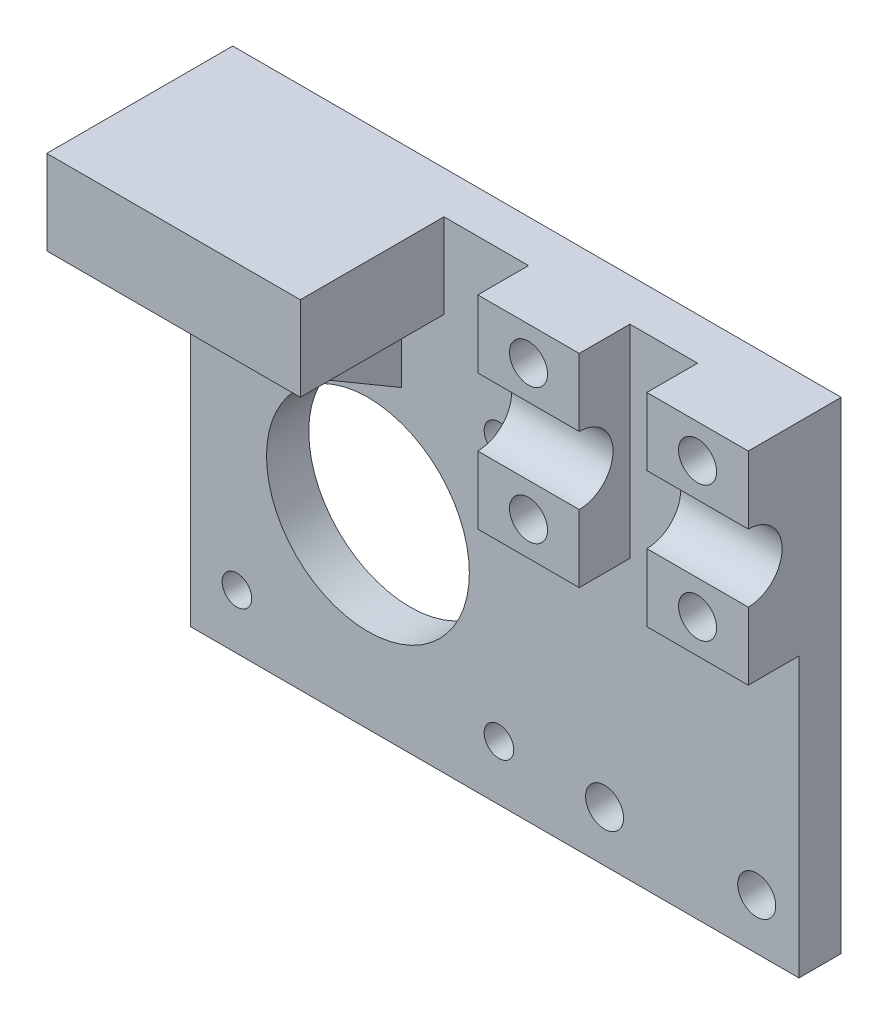
ISO-10303-21;
HEADER;
FILE_DESCRIPTION(('STEP AP214'),'2;1');
FILE_NAME('part.step','',(''),(''),'','','');
FILE_SCHEMA(('AUTOMOTIVE_DESIGN { 1 0 10303 214 1 1 1 1 }'));
ENDSEC;
DATA;
#1=APPLICATION_CONTEXT('core data for automotive mechanical design processes');
#2=APPLICATION_PROTOCOL_DEFINITION('international standard','automotive_design',2000,#1);
#3=PRODUCT_CONTEXT('',#1,'mechanical');
#4=PRODUCT('Part','Part','',(#3));
#5=PRODUCT_RELATED_PRODUCT_CATEGORY('part','',(#4));
#6=PRODUCT_DEFINITION_FORMATION('','',#4);
#7=PRODUCT_DEFINITION_CONTEXT('part definition',#1,'design');
#8=PRODUCT_DEFINITION('design','',#6,#7);
#9=PRODUCT_DEFINITION_SHAPE('','',#8);
#10=(LENGTH_UNIT() NAMED_UNIT(*) SI_UNIT(.MILLI.,.METRE.));
#11=(NAMED_UNIT(*) PLANE_ANGLE_UNIT() SI_UNIT($,.RADIAN.));
#12=(NAMED_UNIT(*) SI_UNIT($,.STERADIAN.) SOLID_ANGLE_UNIT());
#13=UNCERTAINTY_MEASURE_WITH_UNIT(LENGTH_MEASURE(1.E-05),#10,'distance_accuracy_value','');
#14=(GEOMETRIC_REPRESENTATION_CONTEXT(3) GLOBAL_UNCERTAINTY_ASSIGNED_CONTEXT((#13)) GLOBAL_UNIT_ASSIGNED_CONTEXT((#10,
#11,#12)) REPRESENTATION_CONTEXT('',''));
#15=CARTESIAN_POINT('',(0.,0.,0.));
#16=DIRECTION('',(0.,0.,1.));
#17=DIRECTION('',(1.,0.,0.));
#18=AXIS2_PLACEMENT_3D('',#15,#16,#17);
#19=CARTESIAN_POINT('',(-56.,18.5,22.));
#20=DIRECTION('',(0.,1.,0.));
#21=DIRECTION('',(0.,0.,1.));
#22=AXIS2_PLACEMENT_3D('',#19,#20,#21);
#23=PLANE('',#22);
#24=DIRECTION('',(0.,0.,1.));
#25=VECTOR('',#24,1.);
#26=CARTESIAN_POINT('',(-31.,18.5,5.));
#27=LINE('',#26,#25);
#28=CARTESIAN_POINT('',(-31.,18.5,5.));
#29=VERTEX_POINT('',#28);
#30=CARTESIAN_POINT('',(-31.,18.5,22.));
#31=VERTEX_POINT('',#30);
#32=EDGE_CURVE('E232',#29,#31,#27,.T.);
#33=ORIENTED_EDGE('',*,*,#32,.F.);
#34=DIRECTION('',(1.,0.,0.));
#35=VECTOR('',#34,1.);
#36=CARTESIAN_POINT('',(-56.,18.5,5.));
#37=LINE('',#36,#35);
#38=CARTESIAN_POINT('',(-26.,18.5,5.));
#39=VERTEX_POINT('',#38);
#40=EDGE_CURVE('E248',#29,#39,#37,.T.);
#41=ORIENTED_EDGE('',*,*,#40,.T.);
#42=DIRECTION('',(0.,0.,-1.));
#43=VECTOR('',#42,1.);
#44=CARTESIAN_POINT('',(-26.,18.5,22.));
#45=LINE('',#44,#43);
#46=CARTESIAN_POINT('',(-26.,18.5,22.));
#47=VERTEX_POINT('',#46);
#48=EDGE_CURVE('E270',#47,#39,#45,.T.);
#49=ORIENTED_EDGE('',*,*,#48,.F.);
#50=DIRECTION('',(1.,0.,0.));
#51=VECTOR('',#50,1.);
#52=CARTESIAN_POINT('',(-56.,18.5,22.));
#53=LINE('',#52,#51);
#54=EDGE_CURVE('E254',#31,#47,#53,.T.);
#55=ORIENTED_EDGE('',*,*,#54,.F.);
#56=EDGE_LOOP('',(#33,#41,#49,#55));
#57=FACE_BOUND('',#56,.T.);
#58=ADVANCED_FACE('F34',(#57),#23,.F.);
#59=CARTESIAN_POINT('',(0.,0.,5.));
#60=DIRECTION('',(0.,0.,1.));
#61=DIRECTION('',(1.,0.,0.));
#62=AXIS2_PLACEMENT_3D('',#59,#60,#61);
#63=PLANE('',#62);
#64=DIRECTION('',(1.,0.,0.));
#65=VECTOR('',#64,1.);
#66=CARTESIAN_POINT('',(-36.,15.5,5.));
#67=LINE('',#66,#65);
#68=CARTESIAN_POINT('',(-46.,15.5,5.));
#69=VERTEX_POINT('',#68);
#70=CARTESIAN_POINT('',(-36.,15.5,5.));
#71=VERTEX_POINT('',#70);
#72=EDGE_CURVE('E60',#69,#71,#67,.T.);
#73=ORIENTED_EDGE('',*,*,#72,.F.);
#74=DIRECTION('',(0.,-1.,0.));
#75=VECTOR('',#74,1.);
#76=CARTESIAN_POINT('',(-46.,18.5,5.));
#77=LINE('',#76,#75);
#78=CARTESIAN_POINT('',(-46.,18.5,5.));
#79=VERTEX_POINT('',#78);
#80=EDGE_CURVE('E223',#79,#69,#77,.T.);
#81=ORIENTED_EDGE('',*,*,#80,.F.);
#82=CARTESIAN_POINT('',(-56.,18.5,5.));
#83=VERTEX_POINT('',#82);
#84=EDGE_CURVE('E264',#83,#79,#37,.T.);
#85=ORIENTED_EDGE('',*,*,#84,.F.);
#86=DIRECTION('',(0.,-1.,0.));
#87=VECTOR('',#86,1.);
#88=CARTESIAN_POINT('',(-56.,28.5,5.));
#89=LINE('',#88,#87);
#90=CARTESIAN_POINT('',(-56.,-28.5,5.));
#91=VERTEX_POINT('',#90);
#92=EDGE_CURVE('E431',#83,#91,#89,.T.);
#93=ORIENTED_EDGE('',*,*,#92,.T.);
#94=DIRECTION('',(1.,0.,0.));
#95=VECTOR('',#94,1.);
#96=CARTESIAN_POINT('',(-56.,-28.5,5.));
#97=LINE('',#96,#95);
#98=CARTESIAN_POINT('',(16.,-28.5,5.));
#99=VERTEX_POINT('',#98);
#100=EDGE_CURVE('E433',#91,#99,#97,.T.);
#101=ORIENTED_EDGE('',*,*,#100,.T.);
#102=DIRECTION('',(0.,1.,0.));
#103=VECTOR('',#102,1.);
#104=CARTESIAN_POINT('',(16.,28.5,5.));
#105=LINE('',#104,#103);
#106=CARTESIAN_POINT('',(16.,4.49999999999999,5.));
#107=VERTEX_POINT('',#106);
#108=EDGE_CURVE('E436',#99,#107,#105,.T.);
#109=ORIENTED_EDGE('',*,*,#108,.T.);
#110=DIRECTION('',(1.,0.,0.));
#111=VECTOR('',#110,1.);
#112=CARTESIAN_POINT('',(3.99999999999999,4.49999999999999,5.));
#113=LINE('',#112,#111);
#114=CARTESIAN_POINT('',(3.99999999999999,4.49999999999999,5.));
#115=VERTEX_POINT('',#114);
#116=EDGE_CURVE('E401',#115,#107,#113,.T.);
#117=ORIENTED_EDGE('',*,*,#116,.F.);
#118=DIRECTION('',(0.,1.,0.));
#119=VECTOR('',#118,1.);
#120=CARTESIAN_POINT('',(3.99999999999999,4.49999999999999,5.));
#121=LINE('',#120,#119);
#122=CARTESIAN_POINT('',(3.99999999999999,28.5,5.));
#123=VERTEX_POINT('',#122);
#124=EDGE_CURVE('E389',#115,#123,#121,.T.);
#125=ORIENTED_EDGE('',*,*,#124,.T.);
#126=DIRECTION('',(-1.,0.,0.));
#127=VECTOR('',#126,1.);
#128=CARTESIAN_POINT('',(-56.,28.5,5.));
#129=LINE('',#128,#127);
#130=CARTESIAN_POINT('',(-3.99999999999999,28.5,5.));
#131=VERTEX_POINT('',#130);
#132=EDGE_CURVE('E395',#123,#131,#129,.T.);
#133=ORIENTED_EDGE('',*,*,#132,.T.);
#134=DIRECTION('',(0.,1.,0.));
#135=VECTOR('',#134,1.);
#136=CARTESIAN_POINT('',(-3.99999999999999,4.49999999999999,5.));
#137=LINE('',#136,#135);
#138=CARTESIAN_POINT('',(-3.99999999999999,4.49999999999999,5.));
#139=VERTEX_POINT('',#138);
#140=EDGE_CURVE('E331',#139,#131,#137,.T.);
#141=ORIENTED_EDGE('',*,*,#140,.F.);
#142=DIRECTION('',(-1.,0.,0.));
#143=VECTOR('',#142,1.);
#144=CARTESIAN_POINT('',(-3.99999999999999,4.49999999999999,5.));
#145=LINE('',#144,#143);
#146=CARTESIAN_POINT('',(-16.,4.49999999999999,5.));
#147=VERTEX_POINT('',#146);
#148=EDGE_CURVE('E345',#139,#147,#145,.T.);
#149=ORIENTED_EDGE('',*,*,#148,.T.);
#150=DIRECTION('',(0.,1.,0.));
#151=VECTOR('',#150,1.);
#152=CARTESIAN_POINT('',(-16.,4.49999999999999,5.));
#153=LINE('',#152,#151);
#154=CARTESIAN_POINT('',(-16.,28.5,5.));
#155=VERTEX_POINT('',#154);
#156=EDGE_CURVE('E328',#147,#155,#153,.T.);
#157=ORIENTED_EDGE('',*,*,#156,.T.);
#158=CARTESIAN_POINT('',(-26.,28.5,5.));
#159=VERTEX_POINT('',#158);
#160=EDGE_CURVE('E38',#155,#159,#129,.T.);
#161=ORIENTED_EDGE('',*,*,#160,.T.);
#162=DIRECTION('',(0.,1.,0.));
#163=VECTOR('',#162,1.);
#164=CARTESIAN_POINT('',(-26.,28.5,5.));
#165=LINE('',#164,#163);
#166=EDGE_CURVE('E255',#39,#159,#165,.T.);
#167=ORIENTED_EDGE('',*,*,#166,.F.);
#168=ORIENTED_EDGE('',*,*,#40,.F.);
#169=DIRECTION('',(0.,1.,0.));
#170=VECTOR('',#169,1.);
#171=CARTESIAN_POINT('',(-31.,8.49999999999999,5.));
#172=LINE('',#171,#170);
#173=CARTESIAN_POINT('',(-31.,8.49999999999999,5.));
#174=VERTEX_POINT('',#173);
#175=EDGE_CURVE('E209',#174,#29,#172,.T.);
#176=ORIENTED_EDGE('',*,*,#175,.F.);
#177=DIRECTION('',(1.,0.,0.));
#178=VECTOR('',#177,1.);
#179=CARTESIAN_POINT('',(-36.,8.49999999999999,5.));
#180=LINE('',#179,#178);
#181=CARTESIAN_POINT('',(-36.,8.49999999999999,5.));
#182=VERTEX_POINT('',#181);
#183=EDGE_CURVE('E246',#182,#174,#180,.T.);
#184=ORIENTED_EDGE('',*,*,#183,.F.);
#185=DIRECTION('',(0.,1.,0.));
#186=VECTOR('',#185,1.);
#187=CARTESIAN_POINT('',(-36.,8.49999999999999,5.));
#188=LINE('',#187,#186);
#189=EDGE_CURVE('E237',#182,#71,#188,.T.);
#190=ORIENTED_EDGE('',*,*,#189,.T.);
#191=EDGE_LOOP('',(#73,#81,#85,#93,#101,#109,#117,#125,#133,#141,#149,#157,#161,#167,#168,#176,
#184,#190));
#192=FACE_BOUND('',#191,.T.);
#193=CARTESIAN_POINT('',(-35.,-6.50000000000001,5.));
#194=DIRECTION('',(0.,0.,1.));
#195=DIRECTION('',(1.,0.,0.));
#196=AXIS2_PLACEMENT_3D('',#193,#194,#195);
#197=CIRCLE('',#196,12.);
#198=CARTESIAN_POINT('',(-23.,-6.50000000000001,5.));
#199=VERTEX_POINT('',#198);
#200=EDGE_CURVE('E310',#199,#199,#197,.T.);
#201=ORIENTED_EDGE('',*,*,#200,.F.);
#202=EDGE_LOOP('',(#201));
#203=FACE_BOUND('',#202,.T.);
#204=CARTESIAN_POINT('',(-50.5,8.99999999999999,5.));
#205=DIRECTION('',(0.,0.,1.));
#206=DIRECTION('',(1.,0.,0.));
#207=AXIS2_PLACEMENT_3D('',#204,#205,#206);
#208=CIRCLE('',#207,1.75);
#209=CARTESIAN_POINT('',(-48.75,8.99999999999999,5.));
#210=VERTEX_POINT('',#209);
#211=EDGE_CURVE('E304',#210,#210,#208,.T.);
#212=ORIENTED_EDGE('',*,*,#211,.F.);
#213=EDGE_LOOP('',(#212));
#214=FACE_BOUND('',#213,.T.);
#215=CARTESIAN_POINT('',(-19.5,8.99999999999999,5.));
#216=DIRECTION('',(0.,0.,1.));
#217=DIRECTION('',(1.,0.,0.));
#218=AXIS2_PLACEMENT_3D('',#215,#216,#217);
#219=CIRCLE('',#218,1.75);
#220=CARTESIAN_POINT('',(-17.75,8.99999999999999,5.));
#221=VERTEX_POINT('',#220);
#222=EDGE_CURVE('E298',#221,#221,#219,.T.);
#223=ORIENTED_EDGE('',*,*,#222,.F.);
#224=EDGE_LOOP('',(#223));
#225=FACE_BOUND('',#224,.T.);
#226=CARTESIAN_POINT('',(-19.5,-22.,5.));
#227=DIRECTION('',(0.,0.,1.));
#228=DIRECTION('',(1.,0.,0.));
#229=AXIS2_PLACEMENT_3D('',#226,#227,#228);
#230=CIRCLE('',#229,1.75);
#231=CARTESIAN_POINT('',(-17.75,-22.,5.));
#232=VERTEX_POINT('',#231);
#233=EDGE_CURVE('E292',#232,#232,#230,.T.);
#234=ORIENTED_EDGE('',*,*,#233,.F.);
#235=EDGE_LOOP('',(#234));
#236=FACE_BOUND('',#235,.T.);
#237=CARTESIAN_POINT('',(-50.5,-22.,5.));
#238=DIRECTION('',(0.,0.,1.));
#239=DIRECTION('',(1.,0.,0.));
#240=AXIS2_PLACEMENT_3D('',#237,#238,#239);
#241=CIRCLE('',#240,1.75);
#242=CARTESIAN_POINT('',(-48.75,-22.,5.));
#243=VERTEX_POINT('',#242);
#244=EDGE_CURVE('E286',#243,#243,#241,.T.);
#245=ORIENTED_EDGE('',*,*,#244,.F.);
#246=EDGE_LOOP('',(#245));
#247=FACE_BOUND('',#246,.T.);
#248=CARTESIAN_POINT('',(-7.,-22.5,5.));
#249=DIRECTION('',(0.,0.,1.));
#250=DIRECTION('',(1.,0.,0.));
#251=AXIS2_PLACEMENT_3D('',#248,#249,#250);
#252=CIRCLE('',#251,2.25);
#253=CARTESIAN_POINT('',(-4.75,-22.5,5.));
#254=VERTEX_POINT('',#253);
#255=EDGE_CURVE('E280',#254,#254,#252,.T.);
#256=ORIENTED_EDGE('',*,*,#255,.F.);
#257=EDGE_LOOP('',(#256));
#258=FACE_BOUND('',#257,.T.);
#259=CARTESIAN_POINT('',(11.,-22.5,5.));
#260=DIRECTION('',(0.,0.,1.));
#261=DIRECTION('',(1.,0.,0.));
#262=AXIS2_PLACEMENT_3D('',#259,#260,#261);
#263=CIRCLE('',#262,2.25000000000001);
#264=CARTESIAN_POINT('',(13.25,-22.5,5.));
#265=VERTEX_POINT('',#264);
#266=EDGE_CURVE('E276',#265,#265,#263,.T.);
#267=ORIENTED_EDGE('',*,*,#266,.F.);
#268=EDGE_LOOP('',(#267));
#269=FACE_BOUND('',#268,.T.);
#270=ADVANCED_FACE('F468',(#192,#203,#214,#225,#236,#247,#258,#269),#63,.T.);
#271=CARTESIAN_POINT('',(0.,0.,0.));
#272=DIRECTION('',(0.,0.,1.));
#273=DIRECTION('',(1.,0.,0.));
#274=AXIS2_PLACEMENT_3D('',#271,#272,#273);
#275=PLANE('',#274);
#276=DIRECTION('',(1.,0.,0.));
#277=VECTOR('',#276,1.);
#278=CARTESIAN_POINT('',(-36.,15.5,0.));
#279=LINE('',#278,#277);
#280=CARTESIAN_POINT('',(-46.,15.5,0.));
#281=VERTEX_POINT('',#280);
#282=CARTESIAN_POINT('',(-36.,15.5,0.));
#283=VERTEX_POINT('',#282);
#284=EDGE_CURVE('E221',#281,#283,#279,.T.);
#285=ORIENTED_EDGE('',*,*,#284,.T.);
#286=DIRECTION('',(0.,1.,0.));
#287=VECTOR('',#286,1.);
#288=CARTESIAN_POINT('',(-36.,18.5,0.));
#289=LINE('',#288,#287);
#290=CARTESIAN_POINT('',(-36.,18.5,0.));
#291=VERTEX_POINT('',#290);
#292=EDGE_CURVE('E203',#283,#291,#289,.T.);
#293=ORIENTED_EDGE('',*,*,#292,.T.);
#294=DIRECTION('',(-1.,0.,0.));
#295=VECTOR('',#294,1.);
#296=CARTESIAN_POINT('',(-36.,18.5,0.));
#297=LINE('',#296,#295);
#298=CARTESIAN_POINT('',(-46.,18.5,0.));
#299=VERTEX_POINT('',#298);
#300=EDGE_CURVE('E212',#291,#299,#297,.T.);
#301=ORIENTED_EDGE('',*,*,#300,.T.);
#302=DIRECTION('',(0.,-1.,0.));
#303=VECTOR('',#302,1.);
#304=CARTESIAN_POINT('',(-46.,18.5,0.));
#305=LINE('',#304,#303);
#306=EDGE_CURVE('E52',#299,#281,#305,.T.);
#307=ORIENTED_EDGE('',*,*,#306,.T.);
#308=EDGE_LOOP('',(#285,#293,#301,#307));
#309=FACE_BOUND('',#308,.T.);
#310=CARTESIAN_POINT('',(11.,-22.5,0.));
#311=DIRECTION('',(0.,0.,1.));
#312=DIRECTION('',(1.,0.,0.));
#313=AXIS2_PLACEMENT_3D('',#310,#311,#312);
#314=CIRCLE('',#313,2.25000000000001);
#315=CARTESIAN_POINT('',(13.25,-22.5,0.));
#316=VERTEX_POINT('',#315);
#317=EDGE_CURVE('E277',#316,#316,#314,.T.);
#318=ORIENTED_EDGE('',*,*,#317,.T.);
#319=EDGE_LOOP('',(#318));
#320=FACE_BOUND('',#319,.T.);
#321=CARTESIAN_POINT('',(-7.,-22.5,0.));
#322=DIRECTION('',(0.,0.,1.));
#323=DIRECTION('',(1.,0.,0.));
#324=AXIS2_PLACEMENT_3D('',#321,#322,#323);
#325=CIRCLE('',#324,2.25);
#326=CARTESIAN_POINT('',(-4.75,-22.5,0.));
#327=VERTEX_POINT('',#326);
#328=EDGE_CURVE('E283',#327,#327,#325,.T.);
#329=ORIENTED_EDGE('',*,*,#328,.T.);
#330=EDGE_LOOP('',(#329));
#331=FACE_BOUND('',#330,.T.);
#332=CARTESIAN_POINT('',(-50.5,-22.,0.));
#333=DIRECTION('',(0.,0.,1.));
#334=DIRECTION('',(1.,0.,0.));
#335=AXIS2_PLACEMENT_3D('',#332,#333,#334);
#336=CIRCLE('',#335,1.75);
#337=CARTESIAN_POINT('',(-48.75,-22.,0.));
#338=VERTEX_POINT('',#337);
#339=EDGE_CURVE('E289',#338,#338,#336,.T.);
#340=ORIENTED_EDGE('',*,*,#339,.T.);
#341=EDGE_LOOP('',(#340));
#342=FACE_BOUND('',#341,.T.);
#343=CARTESIAN_POINT('',(-19.5,-22.,0.));
#344=DIRECTION('',(0.,0.,1.));
#345=DIRECTION('',(1.,0.,0.));
#346=AXIS2_PLACEMENT_3D('',#343,#344,#345);
#347=CIRCLE('',#346,1.75);
#348=CARTESIAN_POINT('',(-17.75,-22.,0.));
#349=VERTEX_POINT('',#348);
#350=EDGE_CURVE('E295',#349,#349,#347,.T.);
#351=ORIENTED_EDGE('',*,*,#350,.T.);
#352=EDGE_LOOP('',(#351));
#353=FACE_BOUND('',#352,.T.);
#354=CARTESIAN_POINT('',(-19.5,8.99999999999999,0.));
#355=DIRECTION('',(0.,0.,1.));
#356=DIRECTION('',(1.,0.,0.));
#357=AXIS2_PLACEMENT_3D('',#354,#355,#356);
#358=CIRCLE('',#357,1.75);
#359=CARTESIAN_POINT('',(-17.75,8.99999999999999,0.));
#360=VERTEX_POINT('',#359);
#361=EDGE_CURVE('E301',#360,#360,#358,.T.);
#362=ORIENTED_EDGE('',*,*,#361,.T.);
#363=EDGE_LOOP('',(#362));
#364=FACE_BOUND('',#363,.T.);
#365=CARTESIAN_POINT('',(-50.5,8.99999999999999,0.));
#366=DIRECTION('',(0.,0.,1.));
#367=DIRECTION('',(1.,0.,0.));
#368=AXIS2_PLACEMENT_3D('',#365,#366,#367);
#369=CIRCLE('',#368,1.75);
#370=CARTESIAN_POINT('',(-48.75,8.99999999999999,0.));
#371=VERTEX_POINT('',#370);
#372=EDGE_CURVE('E307',#371,#371,#369,.T.);
#373=ORIENTED_EDGE('',*,*,#372,.T.);
#374=EDGE_LOOP('',(#373));
#375=FACE_BOUND('',#374,.T.);
#376=CARTESIAN_POINT('',(-35.,-6.50000000000001,0.));
#377=DIRECTION('',(0.,0.,1.));
#378=DIRECTION('',(1.,0.,0.));
#379=AXIS2_PLACEMENT_3D('',#376,#377,#378);
#380=CIRCLE('',#379,12.);
#381=CARTESIAN_POINT('',(-23.,-6.50000000000001,0.));
#382=VERTEX_POINT('',#381);
#383=EDGE_CURVE('E313',#382,#382,#380,.T.);
#384=ORIENTED_EDGE('',*,*,#383,.T.);
#385=EDGE_LOOP('',(#384));
#386=FACE_BOUND('',#385,.T.);
#387=CARTESIAN_POINT('',(-9.99999999999999,24.5,0.));
#388=DIRECTION('',(0.,0.,-1.));
#389=DIRECTION('',(-1.,0.,0.));
#390=AXIS2_PLACEMENT_3D('',#387,#388,#389);
#391=CIRCLE('',#390,2.25);
#392=CARTESIAN_POINT('',(-12.25,24.5,0.));
#393=VERTEX_POINT('',#392);
#394=EDGE_CURVE('E325',#393,#393,#391,.T.);
#395=ORIENTED_EDGE('',*,*,#394,.F.);
#396=EDGE_LOOP('',(#395));
#397=FACE_BOUND('',#396,.T.);
#398=CARTESIAN_POINT('',(9.99999999999999,8.5,0.));
#399=DIRECTION('',(0.,0.,1.));
#400=DIRECTION('',(1.,0.,0.));
#401=AXIS2_PLACEMENT_3D('',#398,#399,#400);
#402=CIRCLE('',#401,2.25);
#403=CARTESIAN_POINT('',(12.25,8.5,0.));
#404=VERTEX_POINT('',#403);
#405=EDGE_CURVE('E372',#404,#404,#402,.T.);
#406=ORIENTED_EDGE('',*,*,#405,.T.);
#407=EDGE_LOOP('',(#406));
#408=FACE_BOUND('',#407,.T.);
#409=CARTESIAN_POINT('',(9.99999999999999,24.5,0.));
#410=DIRECTION('',(0.,0.,1.));
#411=DIRECTION('',(1.,0.,0.));
#412=AXIS2_PLACEMENT_3D('',#409,#410,#411);
#413=CIRCLE('',#412,2.25);
#414=CARTESIAN_POINT('',(12.25,24.5,0.));
#415=VERTEX_POINT('',#414);
#416=EDGE_CURVE('E378',#415,#415,#413,.T.);
#417=ORIENTED_EDGE('',*,*,#416,.T.);
#418=EDGE_LOOP('',(#417));
#419=FACE_BOUND('',#418,.T.);
#420=DIRECTION('',(0.,-1.,0.));
#421=VECTOR('',#420,1.);
#422=CARTESIAN_POINT('',(-56.,28.5,0.));
#423=LINE('',#422,#421);
#424=CARTESIAN_POINT('',(-56.,28.5,0.));
#425=VERTEX_POINT('',#424);
#426=CARTESIAN_POINT('',(-56.,-28.5,0.));
#427=VERTEX_POINT('',#426);
#428=EDGE_CURVE('E403',#425,#427,#423,.T.);
#429=ORIENTED_EDGE('',*,*,#428,.F.);
#430=DIRECTION('',(-1.,0.,0.));
#431=VECTOR('',#430,1.);
#432=CARTESIAN_POINT('',(-56.,28.5,0.));
#433=LINE('',#432,#431);
#434=CARTESIAN_POINT('',(16.,28.5,0.));
#435=VERTEX_POINT('',#434);
#436=EDGE_CURVE('E434',#435,#425,#433,.T.);
#437=ORIENTED_EDGE('',*,*,#436,.F.);
#438=DIRECTION('',(0.,1.,0.));
#439=VECTOR('',#438,1.);
#440=CARTESIAN_POINT('',(16.,28.5,0.));
#441=LINE('',#440,#439);
#442=CARTESIAN_POINT('',(16.,-28.5,0.));
#443=VERTEX_POINT('',#442);
#444=EDGE_CURVE('E450',#443,#435,#441,.T.);
#445=ORIENTED_EDGE('',*,*,#444,.F.);
#446=DIRECTION('',(1.,0.,0.));
#447=VECTOR('',#446,1.);
#448=CARTESIAN_POINT('',(-56.,-28.5,0.));
#449=LINE('',#448,#447);
#450=EDGE_CURVE('E452',#427,#443,#449,.T.);
#451=ORIENTED_EDGE('',*,*,#450,.F.);
#452=EDGE_LOOP('',(#429,#437,#445,#451));
#453=FACE_BOUND('',#452,.T.);
#454=CARTESIAN_POINT('',(-9.99999999999999,8.5,0.));
#455=DIRECTION('',(0.,0.,-1.));
#456=DIRECTION('',(-1.,0.,0.));
#457=AXIS2_PLACEMENT_3D('',#454,#455,#456);
#458=CIRCLE('',#457,2.25);
#459=CARTESIAN_POINT('',(-12.25,8.5,0.));
#460=VERTEX_POINT('',#459);
#461=EDGE_CURVE('E319',#460,#460,#458,.T.);
#462=ORIENTED_EDGE('',*,*,#461,.F.);
#463=EDGE_LOOP('',(#462));
#464=FACE_BOUND('',#463,.T.);
#465=ADVANCED_FACE('F218',(#309,#320,#331,#342,#353,#364,#375,#386,#397,#408,#419,#453,#464),
#275,.F.);
#466=CARTESIAN_POINT('',(-3.99999999999999,12.5,11.));
#467=DIRECTION('',(0.,0.,-1.));
#468=DIRECTION('',(0.,1.,0.));
#469=AXIS2_PLACEMENT_3D('',#466,#467,#468);
#470=PLANE('',#469);
#471=DIRECTION('',(0.,-1.,0.));
#472=VECTOR('',#471,1.);
#473=CARTESIAN_POINT('',(-16.,12.5,11.));
#474=LINE('',#473,#472);
#475=CARTESIAN_POINT('',(-16.,12.5,11.));
#476=VERTEX_POINT('',#475);
#477=CARTESIAN_POINT('',(-16.,4.5,11.));
#478=VERTEX_POINT('',#477);
#479=EDGE_CURVE('E350',#476,#478,#474,.T.);
#480=ORIENTED_EDGE('',*,*,#479,.T.);
#481=DIRECTION('',(-1.,0.,0.));
#482=VECTOR('',#481,1.);
#483=CARTESIAN_POINT('',(-3.99999999999999,4.49999999999999,11.));
#484=LINE('',#483,#482);
#485=CARTESIAN_POINT('',(-3.99999999999999,4.49999999999999,11.));
#486=VERTEX_POINT('',#485);
#487=EDGE_CURVE('E367',#486,#478,#484,.T.);
#488=ORIENTED_EDGE('',*,*,#487,.F.);
#489=DIRECTION('',(0.,-1.,0.));
#490=VECTOR('',#489,1.);
#491=CARTESIAN_POINT('',(-3.99999999999999,12.5,11.));
#492=LINE('',#491,#490);
#493=CARTESIAN_POINT('',(-3.99999999999999,12.5,11.));
#494=VERTEX_POINT('',#493);
#495=EDGE_CURVE('E337',#494,#486,#492,.T.);
#496=ORIENTED_EDGE('',*,*,#495,.F.);
#497=DIRECTION('',(-1.,0.,0.));
#498=VECTOR('',#497,1.);
#499=CARTESIAN_POINT('',(-3.99999999999999,12.5,11.));
#500=LINE('',#499,#498);
#501=EDGE_CURVE('E364',#494,#476,#500,.T.);
#502=ORIENTED_EDGE('',*,*,#501,.T.);
#503=EDGE_LOOP('',(#480,#488,#496,#502));
#504=FACE_BOUND('',#503,.T.);
#505=CARTESIAN_POINT('',(-9.99999999999999,8.5,11.));
#506=DIRECTION('',(0.,0.,-1.));
#507=DIRECTION('',(-1.,0.,0.));
#508=AXIS2_PLACEMENT_3D('',#505,#506,#507);
#509=CIRCLE('',#508,2.25);
#510=CARTESIAN_POINT('',(-12.25,8.5,11.));
#511=VERTEX_POINT('',#510);
#512=EDGE_CURVE('E316',#511,#511,#509,.T.);
#513=ORIENTED_EDGE('',*,*,#512,.T.);
#514=EDGE_LOOP('',(#513));
#515=FACE_BOUND('',#514,.T.);
#516=ADVANCED_FACE('F595',(#504,#515),#470,.F.);
#517=CARTESIAN_POINT('',(-3.99999999999999,28.5,11.));
#518=DIRECTION('',(0.,0.,-1.));
#519=DIRECTION('',(-1.,0.,0.));
#520=AXIS2_PLACEMENT_3D('',#517,#518,#519);
#521=PLANE('',#520);
#522=DIRECTION('',(0.,-1.,0.));
#523=VECTOR('',#522,1.);
#524=CARTESIAN_POINT('',(-16.,28.5,11.));
#525=LINE('',#524,#523);
#526=CARTESIAN_POINT('',(-16.,28.5,11.));
#527=VERTEX_POINT('',#526);
#528=CARTESIAN_POINT('',(-16.,20.5,11.));
#529=VERTEX_POINT('',#528);
#530=EDGE_CURVE('E354',#527,#529,#525,.T.);
#531=ORIENTED_EDGE('',*,*,#530,.T.);
#532=DIRECTION('',(-1.,0.,0.));
#533=VECTOR('',#532,1.);
#534=CARTESIAN_POINT('',(-3.99999999999999,20.5,11.));
#535=LINE('',#534,#533);
#536=CARTESIAN_POINT('',(-3.99999999999999,20.5,11.));
#537=VERTEX_POINT('',#536);
#538=EDGE_CURVE('E361',#537,#529,#535,.T.);
#539=ORIENTED_EDGE('',*,*,#538,.F.);
#540=DIRECTION('',(0.,-1.,0.));
#541=VECTOR('',#540,1.);
#542=CARTESIAN_POINT('',(-3.99999999999999,28.5,11.));
#543=LINE('',#542,#541);
#544=CARTESIAN_POINT('',(-3.99999999999999,28.5,11.));
#545=VERTEX_POINT('',#544);
#546=EDGE_CURVE('E341',#545,#537,#543,.T.);
#547=ORIENTED_EDGE('',*,*,#546,.F.);
#548=DIRECTION('',(-1.,0.,0.));
#549=VECTOR('',#548,1.);
#550=CARTESIAN_POINT('',(-3.99999999999999,28.5,11.));
#551=LINE('',#550,#549);
#552=EDGE_CURVE('E357',#545,#527,#551,.T.);
#553=ORIENTED_EDGE('',*,*,#552,.T.);
#554=EDGE_LOOP('',(#531,#539,#547,#553));
#555=FACE_BOUND('',#554,.T.);
#556=CARTESIAN_POINT('',(-9.99999999999999,24.5,11.));
#557=DIRECTION('',(0.,0.,-1.));
#558=DIRECTION('',(-1.,0.,0.));
#559=AXIS2_PLACEMENT_3D('',#556,#557,#558);
#560=CIRCLE('',#559,2.25);
#561=CARTESIAN_POINT('',(-12.25,24.5,11.));
#562=VERTEX_POINT('',#561);
#563=EDGE_CURVE('E322',#562,#562,#560,.T.);
#564=ORIENTED_EDGE('',*,*,#563,.T.);
#565=EDGE_LOOP('',(#564));
#566=FACE_BOUND('',#565,.T.);
#567=ADVANCED_FACE('F592',(#555,#566),#521,.F.);
#568=CARTESIAN_POINT('',(-56.,28.5,5.));
#569=DIRECTION('',(1.,0.,0.));
#570=DIRECTION('',(0.,1.,0.));
#571=AXIS2_PLACEMENT_3D('',#568,#569,#570);
#572=PLANE('',#571);
#573=ORIENTED_EDGE('',*,*,#428,.T.);
#574=DIRECTION('',(0.,0.,-1.));
#575=VECTOR('',#574,1.);
#576=CARTESIAN_POINT('',(-56.,-28.5,5.));
#577=LINE('',#576,#575);
#578=EDGE_CURVE('E11',#91,#427,#577,.T.);
#579=ORIENTED_EDGE('',*,*,#578,.F.);
#580=ORIENTED_EDGE('',*,*,#92,.F.);
#581=DIRECTION('',(0.,0.,-1.));
#582=VECTOR('',#581,1.);
#583=CARTESIAN_POINT('',(-56.,18.5,22.));
#584=LINE('',#583,#582);
#585=CARTESIAN_POINT('',(-56.,18.5,22.));
#586=VERTEX_POINT('',#585);
#587=EDGE_CURVE('E273',#586,#83,#584,.T.);
#588=ORIENTED_EDGE('',*,*,#587,.F.);
#589=DIRECTION('',(0.,-1.,0.));
#590=VECTOR('',#589,1.);
#591=CARTESIAN_POINT('',(-56.,28.5,22.));
#592=LINE('',#591,#590);
#593=CARTESIAN_POINT('',(-56.,28.5,22.));
#594=VERTEX_POINT('',#593);
#595=EDGE_CURVE('E251',#594,#586,#592,.T.);
#596=ORIENTED_EDGE('',*,*,#595,.F.);
#597=DIRECTION('',(0.,0.,-1.));
#598=VECTOR('',#597,1.);
#599=CARTESIAN_POINT('',(-56.,28.5,5.));
#600=LINE('',#599,#598);
#601=EDGE_CURVE('E446',#594,#425,#600,.T.);
#602=ORIENTED_EDGE('',*,*,#601,.T.);
#603=EDGE_LOOP('',(#573,#579,#580,#588,#596,#602));
#604=FACE_BOUND('',#603,.T.);
#605=ADVANCED_FACE('F36',(#604),#572,.F.);
#606=CARTESIAN_POINT('',(-56.,-28.5,5.));
#607=DIRECTION('',(0.,1.,0.));
#608=DIRECTION('',(0.,0.,1.));
#609=AXIS2_PLACEMENT_3D('',#606,#607,#608);
#610=PLANE('',#609);
#611=ORIENTED_EDGE('',*,*,#450,.T.);
#612=DIRECTION('',(0.,0.,-1.));
#613=VECTOR('',#612,1.);
#614=CARTESIAN_POINT('',(16.,-28.5,5.));
#615=LINE('',#614,#613);
#616=EDGE_CURVE('E44',#99,#443,#615,.T.);
#617=ORIENTED_EDGE('',*,*,#616,.F.);
#618=ORIENTED_EDGE('',*,*,#100,.F.);
#619=ORIENTED_EDGE('',*,*,#578,.T.);
#620=EDGE_LOOP('',(#611,#617,#618,#619));
#621=FACE_BOUND('',#620,.T.);
#622=ADVANCED_FACE('F466',(#621),#610,.F.);
#623=CARTESIAN_POINT('',(16.,28.5,5.));
#624=DIRECTION('',(-1.,0.,0.));
#625=DIRECTION('',(0.,-1.,0.));
#626=AXIS2_PLACEMENT_3D('',#623,#624,#625);
#627=PLANE('',#626);
#628=ORIENTED_EDGE('',*,*,#444,.T.);
#629=DIRECTION('',(0.,0.,-1.));
#630=VECTOR('',#629,1.);
#631=CARTESIAN_POINT('',(16.,28.5,5.));
#632=LINE('',#631,#630);
#633=CARTESIAN_POINT('',(16.,28.5,11.));
#634=VERTEX_POINT('',#633);
#635=EDGE_CURVE('E443',#634,#435,#632,.T.);
#636=ORIENTED_EDGE('',*,*,#635,.F.);
#637=DIRECTION('',(0.,-1.,0.));
#638=VECTOR('',#637,1.);
#639=CARTESIAN_POINT('',(16.,28.5,11.));
#640=LINE('',#639,#638);
#641=CARTESIAN_POINT('',(16.,20.5,11.));
#642=VERTEX_POINT('',#641);
#643=EDGE_CURVE('E381',#634,#642,#640,.T.);
#644=ORIENTED_EDGE('',*,*,#643,.T.);
#645=CARTESIAN_POINT('',(16.,16.5,11.));
#646=DIRECTION('',(-1.,0.,0.));
#647=DIRECTION('',(0.,-1.,0.));
#648=AXIS2_PLACEMENT_3D('',#645,#646,#647);
#649=CIRCLE('',#648,4.);
#650=CARTESIAN_POINT('',(16.,12.5,11.));
#651=VERTEX_POINT('',#650);
#652=EDGE_CURVE('E415',#642,#651,#649,.T.);
#653=ORIENTED_EDGE('',*,*,#652,.T.);
#654=DIRECTION('',(0.,-1.,0.));
#655=VECTOR('',#654,1.);
#656=CARTESIAN_POINT('',(16.,12.5,11.));
#657=LINE('',#656,#655);
#658=CARTESIAN_POINT('',(16.,4.5,11.));
#659=VERTEX_POINT('',#658);
#660=EDGE_CURVE('E408',#651,#659,#657,.T.);
#661=ORIENTED_EDGE('',*,*,#660,.T.);
#662=DIRECTION('',(0.,0.,-1.));
#663=VECTOR('',#662,1.);
#664=CARTESIAN_POINT('',(16.,4.5,11.));
#665=LINE('',#664,#663);
#666=EDGE_CURVE('E394',#659,#107,#665,.T.);
#667=ORIENTED_EDGE('',*,*,#666,.T.);
#668=ORIENTED_EDGE('',*,*,#108,.F.);
#669=ORIENTED_EDGE('',*,*,#616,.T.);
#670=EDGE_LOOP('',(#628,#636,#644,#653,#661,#667,#668,#669));
#671=FACE_BOUND('',#670,.T.);
#672=ADVANCED_FACE('F483',(#671),#627,.F.);
#673=CARTESIAN_POINT('',(-56.,28.5,5.));
#674=DIRECTION('',(0.,-1.,0.));
#675=DIRECTION('',(1.,0.,0.));
#676=AXIS2_PLACEMENT_3D('',#673,#674,#675);
#677=PLANE('',#676);
#678=ORIENTED_EDGE('',*,*,#436,.T.);
#679=ORIENTED_EDGE('',*,*,#601,.F.);
#680=DIRECTION('',(-1.,0.,0.));
#681=VECTOR('',#680,1.);
#682=CARTESIAN_POINT('',(-56.,28.5,22.));
#683=LINE('',#682,#681);
#684=CARTESIAN_POINT('',(-26.,28.5,22.));
#685=VERTEX_POINT('',#684);
#686=EDGE_CURVE('E260',#685,#594,#683,.T.);
#687=ORIENTED_EDGE('',*,*,#686,.F.);
#688=DIRECTION('',(0.,0.,-1.));
#689=VECTOR('',#688,1.);
#690=CARTESIAN_POINT('',(-26.,28.5,22.));
#691=LINE('',#690,#689);
#692=EDGE_CURVE('E263',#685,#159,#691,.T.);
#693=ORIENTED_EDGE('',*,*,#692,.T.);
#694=ORIENTED_EDGE('',*,*,#160,.F.);
#695=DIRECTION('',(0.,0.,1.));
#696=VECTOR('',#695,1.);
#697=CARTESIAN_POINT('',(-16.,28.5,5.));
#698=LINE('',#697,#696);
#699=EDGE_CURVE('E335',#155,#527,#698,.T.);
#700=ORIENTED_EDGE('',*,*,#699,.T.);
#701=ORIENTED_EDGE('',*,*,#552,.F.);
#702=DIRECTION('',(0.,0.,1.));
#703=VECTOR('',#702,1.);
#704=CARTESIAN_POINT('',(-3.99999999999999,28.5,5.));
#705=LINE('',#704,#703);
#706=EDGE_CURVE('E343',#131,#545,#705,.T.);
#707=ORIENTED_EDGE('',*,*,#706,.F.);
#708=ORIENTED_EDGE('',*,*,#132,.F.);
#709=DIRECTION('',(0.,0.,1.));
#710=VECTOR('',#709,1.);
#711=CARTESIAN_POINT('',(3.99999999999999,28.5,5.));
#712=LINE('',#711,#710);
#713=CARTESIAN_POINT('',(3.99999999999999,28.5,11.));
#714=VERTEX_POINT('',#713);
#715=EDGE_CURVE('E393',#123,#714,#712,.T.);
#716=ORIENTED_EDGE('',*,*,#715,.T.);
#717=DIRECTION('',(1.,0.,0.));
#718=VECTOR('',#717,1.);
#719=CARTESIAN_POINT('',(3.99999999999999,28.5,11.));
#720=LINE('',#719,#718);
#721=EDGE_CURVE('E427',#714,#634,#720,.T.);
#722=ORIENTED_EDGE('',*,*,#721,.T.);
#723=ORIENTED_EDGE('',*,*,#635,.T.);
#724=EDGE_LOOP('',(#678,#679,#687,#693,#694,#700,#701,#707,#708,#716,#722,#723));
#725=FACE_BOUND('',#724,.T.);
#726=ADVANCED_FACE('F479',(#725),#677,.F.);
#727=CARTESIAN_POINT('',(3.99999999999999,4.49999999999999,11.));
#728=DIRECTION('',(0.,-1.,0.));
#729=DIRECTION('',(0.,0.,-1.));
#730=AXIS2_PLACEMENT_3D('',#727,#728,#729);
#731=PLANE('',#730);
#732=ORIENTED_EDGE('',*,*,#666,.F.);
#733=DIRECTION('',(1.,0.,0.));
#734=VECTOR('',#733,1.);
#735=CARTESIAN_POINT('',(3.99999999999999,4.49999999999999,11.));
#736=LINE('',#735,#734);
#737=CARTESIAN_POINT('',(3.99999999999999,4.49999999999999,11.));
#738=VERTEX_POINT('',#737);
#739=EDGE_CURVE('E404',#738,#659,#736,.T.);
#740=ORIENTED_EDGE('',*,*,#739,.F.);
#741=DIRECTION('',(0.,0.,-1.));
#742=VECTOR('',#741,1.);
#743=CARTESIAN_POINT('',(3.99999999999999,4.49999999999999,11.));
#744=LINE('',#743,#742);
#745=EDGE_CURVE('E430',#738,#115,#744,.T.);
#746=ORIENTED_EDGE('',*,*,#745,.T.);
#747=ORIENTED_EDGE('',*,*,#116,.T.);
#748=EDGE_LOOP('',(#732,#740,#746,#747));
#749=FACE_BOUND('',#748,.T.);
#750=ADVANCED_FACE('F617',(#749),#731,.T.);
#751=CARTESIAN_POINT('',(3.99999999999999,12.5,11.));
#752=DIRECTION('',(0.,0.,1.));
#753=DIRECTION('',(0.,-1.,0.));
#754=AXIS2_PLACEMENT_3D('',#751,#752,#753);
#755=PLANE('',#754);
#756=CARTESIAN_POINT('',(9.99999999999999,8.5,11.));
#757=DIRECTION('',(0.,0.,1.));
#758=DIRECTION('',(1.,0.,0.));
#759=AXIS2_PLACEMENT_3D('',#756,#757,#758);
#760=CIRCLE('',#759,2.25);
#761=CARTESIAN_POINT('',(12.25,8.5,11.));
#762=VERTEX_POINT('',#761);
#763=EDGE_CURVE('E360',#762,#762,#760,.T.);
#764=ORIENTED_EDGE('',*,*,#763,.F.);
#765=EDGE_LOOP('',(#764));
#766=FACE_BOUND('',#765,.T.);
#767=ORIENTED_EDGE('',*,*,#660,.F.);
#768=DIRECTION('',(1.,0.,0.));
#769=VECTOR('',#768,1.);
#770=CARTESIAN_POINT('',(3.99999999999999,12.5,11.));
#771=LINE('',#770,#769);
#772=CARTESIAN_POINT('',(3.99999999999999,12.5,11.));
#773=VERTEX_POINT('',#772);
#774=EDGE_CURVE('E423',#773,#651,#771,.T.);
#775=ORIENTED_EDGE('',*,*,#774,.F.);
#776=DIRECTION('',(0.,-1.,0.));
#777=VECTOR('',#776,1.);
#778=CARTESIAN_POINT('',(3.99999999999999,12.5,11.));
#779=LINE('',#778,#777);
#780=EDGE_CURVE('E489',#773,#738,#779,.T.);
#781=ORIENTED_EDGE('',*,*,#780,.T.);
#782=ORIENTED_EDGE('',*,*,#739,.T.);
#783=EDGE_LOOP('',(#767,#775,#781,#782));
#784=FACE_BOUND('',#783,.T.);
#785=ADVANCED_FACE('F620',(#766,#784),#755,.T.);
#786=CARTESIAN_POINT('',(3.99999999999999,16.5,11.));
#787=DIRECTION('',(1.,0.,0.));
#788=DIRECTION('',(0.,1.,0.));
#789=AXIS2_PLACEMENT_3D('',#786,#787,#788);
#790=CYLINDRICAL_SURFACE('',#789,4.);
#791=ORIENTED_EDGE('',*,*,#652,.F.);
#792=DIRECTION('',(1.,0.,0.));
#793=VECTOR('',#792,1.);
#794=CARTESIAN_POINT('',(3.99999999999999,20.5,11.));
#795=LINE('',#794,#793);
#796=CARTESIAN_POINT('',(3.99999999999999,20.5,11.));
#797=VERTEX_POINT('',#796);
#798=EDGE_CURVE('E425',#797,#642,#795,.T.);
#799=ORIENTED_EDGE('',*,*,#798,.F.);
#800=CARTESIAN_POINT('',(3.99999999999999,16.5,11.));
#801=DIRECTION('',(-1.,0.,0.));
#802=DIRECTION('',(0.,-1.,0.));
#803=AXIS2_PLACEMENT_3D('',#800,#801,#802);
#804=CIRCLE('',#803,4.);
#805=EDGE_CURVE('E491',#797,#773,#804,.T.);
#806=ORIENTED_EDGE('',*,*,#805,.T.);
#807=ORIENTED_EDGE('',*,*,#774,.T.);
#808=EDGE_LOOP('',(#791,#799,#806,#807));
#809=FACE_BOUND('',#808,.T.);
#810=ADVANCED_FACE('F624',(#809),#790,.F.);
#811=CARTESIAN_POINT('',(3.99999999999999,28.5,11.));
#812=DIRECTION('',(0.,0.,1.));
#813=DIRECTION('',(1.,0.,0.));
#814=AXIS2_PLACEMENT_3D('',#811,#812,#813);
#815=PLANE('',#814);
#816=CARTESIAN_POINT('',(9.99999999999999,24.5,11.));
#817=DIRECTION('',(0.,0.,1.));
#818=DIRECTION('',(1.,0.,0.));
#819=AXIS2_PLACEMENT_3D('',#816,#817,#818);
#820=CIRCLE('',#819,2.25);
#821=CARTESIAN_POINT('',(12.25,24.5,11.));
#822=VERTEX_POINT('',#821);
#823=EDGE_CURVE('E375',#822,#822,#820,.T.);
#824=ORIENTED_EDGE('',*,*,#823,.F.);
#825=EDGE_LOOP('',(#824));
#826=FACE_BOUND('',#825,.T.);
#827=ORIENTED_EDGE('',*,*,#643,.F.);
#828=ORIENTED_EDGE('',*,*,#721,.F.);
#829=DIRECTION('',(0.,-1.,0.));
#830=VECTOR('',#829,1.);
#831=CARTESIAN_POINT('',(3.99999999999999,28.5,11.));
#832=LINE('',#831,#830);
#833=EDGE_CURVE('E386',#714,#797,#832,.T.);
#834=ORIENTED_EDGE('',*,*,#833,.T.);
#835=ORIENTED_EDGE('',*,*,#798,.T.);
#836=EDGE_LOOP('',(#827,#828,#834,#835));
#837=FACE_BOUND('',#836,.T.);
#838=ADVANCED_FACE('F497',(#826,#837),#815,.T.);
#839=CARTESIAN_POINT('',(3.99999999999999,16.5,11.));
#840=DIRECTION('',(-1.,0.,0.));
#841=DIRECTION('',(0.,-1.,0.));
#842=AXIS2_PLACEMENT_3D('',#839,#840,#841);
#843=PLANE('',#842);
#844=ORIENTED_EDGE('',*,*,#124,.F.);
#845=ORIENTED_EDGE('',*,*,#745,.F.);
#846=ORIENTED_EDGE('',*,*,#780,.F.);
#847=ORIENTED_EDGE('',*,*,#805,.F.);
#848=ORIENTED_EDGE('',*,*,#833,.F.);
#849=ORIENTED_EDGE('',*,*,#715,.F.);
#850=EDGE_LOOP('',(#844,#845,#846,#847,#848,#849));
#851=FACE_BOUND('',#850,.T.);
#852=ADVANCED_FACE('F499',(#851),#843,.T.);
#853=CARTESIAN_POINT('',(9.99999999999999,24.5,0.));
#854=DIRECTION('',(0.,0.,1.));
#855=DIRECTION('',(1.,0.,0.));
#856=AXIS2_PLACEMENT_3D('',#853,#854,#855);
#857=CYLINDRICAL_SURFACE('',#856,2.25);
#858=ORIENTED_EDGE('',*,*,#416,.F.);
#859=EDGE_LOOP('',(#858));
#860=FACE_BOUND('',#859,.T.);
#861=ORIENTED_EDGE('',*,*,#823,.T.);
#862=EDGE_LOOP('',(#861));
#863=FACE_BOUND('',#862,.T.);
#864=ADVANCED_FACE('F610',(#860,#863),#857,.F.);
#865=CARTESIAN_POINT('',(9.99999999999999,8.5,0.));
#866=DIRECTION('',(0.,0.,1.));
#867=DIRECTION('',(1.,0.,0.));
#868=AXIS2_PLACEMENT_3D('',#865,#866,#867);
#869=CYLINDRICAL_SURFACE('',#868,2.25);
#870=ORIENTED_EDGE('',*,*,#405,.F.);
#871=EDGE_LOOP('',(#870));
#872=FACE_BOUND('',#871,.T.);
#873=ORIENTED_EDGE('',*,*,#763,.T.);
#874=EDGE_LOOP('',(#873));
#875=FACE_BOUND('',#874,.T.);
#876=ADVANCED_FACE('F600',(#872,#875),#869,.F.);
#877=CARTESIAN_POINT('',(-3.99999999999999,16.5,11.));
#878=DIRECTION('',(-1.,0.,0.));
#879=DIRECTION('',(0.,-1.,0.));
#880=AXIS2_PLACEMENT_3D('',#877,#878,#879);
#881=CYLINDRICAL_SURFACE('',#880,4.);
#882=CARTESIAN_POINT('',(-16.,16.5,11.));
#883=DIRECTION('',(-1.,0.,0.));
#884=DIRECTION('',(0.,-1.,0.));
#885=AXIS2_PLACEMENT_3D('',#882,#883,#884);
#886=CIRCLE('',#885,4.);
#887=EDGE_CURVE('E352',#529,#476,#886,.T.);
#888=ORIENTED_EDGE('',*,*,#887,.T.);
#889=ORIENTED_EDGE('',*,*,#501,.F.);
#890=CARTESIAN_POINT('',(-3.99999999999999,16.5,11.));
#891=DIRECTION('',(-1.,0.,0.));
#892=DIRECTION('',(0.,-1.,0.));
#893=AXIS2_PLACEMENT_3D('',#890,#891,#892);
#894=CIRCLE('',#893,4.);
#895=EDGE_CURVE('E339',#537,#494,#894,.T.);
#896=ORIENTED_EDGE('',*,*,#895,.F.);
#897=ORIENTED_EDGE('',*,*,#538,.T.);
#898=EDGE_LOOP('',(#888,#889,#896,#897));
#899=FACE_BOUND('',#898,.T.);
#900=ADVANCED_FACE('F597',(#899),#881,.F.);
#901=CARTESIAN_POINT('',(-3.99999999999999,4.49999999999999,11.));
#902=DIRECTION('',(0.,1.,0.));
#903=DIRECTION('',(0.,0.,1.));
#904=AXIS2_PLACEMENT_3D('',#901,#902,#903);
#905=PLANE('',#904);
#906=DIRECTION('',(0.,0.,-1.));
#907=VECTOR('',#906,1.);
#908=CARTESIAN_POINT('',(-16.,4.5,11.));
#909=LINE('',#908,#907);
#910=EDGE_CURVE('E348',#478,#147,#909,.T.);
#911=ORIENTED_EDGE('',*,*,#910,.T.);
#912=ORIENTED_EDGE('',*,*,#148,.F.);
#913=DIRECTION('',(0.,0.,-1.));
#914=VECTOR('',#913,1.);
#915=CARTESIAN_POINT('',(-3.99999999999999,4.49999999999999,11.));
#916=LINE('',#915,#914);
#917=EDGE_CURVE('E334',#486,#139,#916,.T.);
#918=ORIENTED_EDGE('',*,*,#917,.F.);
#919=ORIENTED_EDGE('',*,*,#487,.T.);
#920=EDGE_LOOP('',(#911,#912,#918,#919));
#921=FACE_BOUND('',#920,.T.);
#922=ADVANCED_FACE('F587',(#921),#905,.F.);
#923=CARTESIAN_POINT('',(-3.99999999999999,16.5,11.));
#924=DIRECTION('',(1.,0.,0.));
#925=DIRECTION('',(0.,-1.,0.));
#926=AXIS2_PLACEMENT_3D('',#923,#924,#925);
#927=PLANE('',#926);
#928=ORIENTED_EDGE('',*,*,#140,.T.);
#929=ORIENTED_EDGE('',*,*,#706,.T.);
#930=ORIENTED_EDGE('',*,*,#546,.T.);
#931=ORIENTED_EDGE('',*,*,#895,.T.);
#932=ORIENTED_EDGE('',*,*,#495,.T.);
#933=ORIENTED_EDGE('',*,*,#917,.T.);
#934=EDGE_LOOP('',(#928,#929,#930,#931,#932,#933));
#935=FACE_BOUND('',#934,.T.);
#936=ADVANCED_FACE('F584',(#935),#927,.T.);
#937=CARTESIAN_POINT('',(-16.,16.5,11.));
#938=DIRECTION('',(1.,0.,0.));
#939=DIRECTION('',(0.,-1.,0.));
#940=AXIS2_PLACEMENT_3D('',#937,#938,#939);
#941=PLANE('',#940);
#942=ORIENTED_EDGE('',*,*,#156,.F.);
#943=ORIENTED_EDGE('',*,*,#910,.F.);
#944=ORIENTED_EDGE('',*,*,#479,.F.);
#945=ORIENTED_EDGE('',*,*,#887,.F.);
#946=ORIENTED_EDGE('',*,*,#530,.F.);
#947=ORIENTED_EDGE('',*,*,#699,.F.);
#948=EDGE_LOOP('',(#942,#943,#944,#945,#946,#947));
#949=FACE_BOUND('',#948,.T.);
#950=ADVANCED_FACE('F582',(#949),#941,.F.);
#951=CARTESIAN_POINT('',(-9.99999999999999,24.5,0.));
#952=DIRECTION('',(0.,0.,1.));
#953=DIRECTION('',(1.,0.,0.));
#954=AXIS2_PLACEMENT_3D('',#951,#952,#953);
#955=CYLINDRICAL_SURFACE('',#954,2.25);
#956=ORIENTED_EDGE('',*,*,#394,.T.);
#957=EDGE_LOOP('',(#956));
#958=FACE_BOUND('',#957,.T.);
#959=ORIENTED_EDGE('',*,*,#563,.F.);
#960=EDGE_LOOP('',(#959));
#961=FACE_BOUND('',#960,.T.);
#962=ADVANCED_FACE('F578',(#958,#961),#955,.F.);
#963=CARTESIAN_POINT('',(-9.99999999999999,8.5,0.));
#964=DIRECTION('',(0.,0.,1.));
#965=DIRECTION('',(1.,0.,0.));
#966=AXIS2_PLACEMENT_3D('',#963,#964,#965);
#967=CYLINDRICAL_SURFACE('',#966,2.25);
#968=ORIENTED_EDGE('',*,*,#461,.T.);
#969=EDGE_LOOP('',(#968));
#970=FACE_BOUND('',#969,.T.);
#971=ORIENTED_EDGE('',*,*,#512,.F.);
#972=EDGE_LOOP('',(#971));
#973=FACE_BOUND('',#972,.T.);
#974=ADVANCED_FACE('F574',(#970,#973),#967,.F.);
#975=CARTESIAN_POINT('',(-35.,-6.50000000000001,0.));
#976=DIRECTION('',(0.,0.,1.));
#977=DIRECTION('',(1.,0.,0.));
#978=AXIS2_PLACEMENT_3D('',#975,#976,#977);
#979=CYLINDRICAL_SURFACE('',#978,12.);
#980=ORIENTED_EDGE('',*,*,#383,.F.);
#981=EDGE_LOOP('',(#980));
#982=FACE_BOUND('',#981,.T.);
#983=ORIENTED_EDGE('',*,*,#200,.T.);
#984=EDGE_LOOP('',(#983));
#985=FACE_BOUND('',#984,.T.);
#986=ADVANCED_FACE('F570',(#982,#985),#979,.F.);
#987=CARTESIAN_POINT('',(-50.5,8.99999999999999,0.));
#988=DIRECTION('',(0.,0.,1.));
#989=DIRECTION('',(1.,0.,0.));
#990=AXIS2_PLACEMENT_3D('',#987,#988,#989);
#991=CYLINDRICAL_SURFACE('',#990,1.75);
#992=ORIENTED_EDGE('',*,*,#372,.F.);
#993=EDGE_LOOP('',(#992));
#994=FACE_BOUND('',#993,.T.);
#995=ORIENTED_EDGE('',*,*,#211,.T.);
#996=EDGE_LOOP('',(#995));
#997=FACE_BOUND('',#996,.T.);
#998=ADVANCED_FACE('F566',(#994,#997),#991,.F.);
#999=CARTESIAN_POINT('',(-19.5,8.99999999999999,0.));
#1000=DIRECTION('',(0.,0.,1.));
#1001=DIRECTION('',(1.,0.,0.));
#1002=AXIS2_PLACEMENT_3D('',#999,#1000,#1001);
#1003=CYLINDRICAL_SURFACE('',#1002,1.75);
#1004=ORIENTED_EDGE('',*,*,#361,.F.);
#1005=EDGE_LOOP('',(#1004));
#1006=FACE_BOUND('',#1005,.T.);
#1007=ORIENTED_EDGE('',*,*,#222,.T.);
#1008=EDGE_LOOP('',(#1007));
#1009=FACE_BOUND('',#1008,.T.);
#1010=ADVANCED_FACE('F562',(#1006,#1009),#1003,.F.);
#1011=CARTESIAN_POINT('',(-19.5,-22.,0.));
#1012=DIRECTION('',(0.,0.,1.));
#1013=DIRECTION('',(1.,0.,0.));
#1014=AXIS2_PLACEMENT_3D('',#1011,#1012,#1013);
#1015=CYLINDRICAL_SURFACE('',#1014,1.75);
#1016=ORIENTED_EDGE('',*,*,#350,.F.);
#1017=EDGE_LOOP('',(#1016));
#1018=FACE_BOUND('',#1017,.T.);
#1019=ORIENTED_EDGE('',*,*,#233,.T.);
#1020=EDGE_LOOP('',(#1019));
#1021=FACE_BOUND('',#1020,.T.);
#1022=ADVANCED_FACE('F558',(#1018,#1021),#1015,.F.);
#1023=CARTESIAN_POINT('',(-50.5,-22.,0.));
#1024=DIRECTION('',(0.,0.,1.));
#1025=DIRECTION('',(1.,0.,0.));
#1026=AXIS2_PLACEMENT_3D('',#1023,#1024,#1025);
#1027=CYLINDRICAL_SURFACE('',#1026,1.75);
#1028=ORIENTED_EDGE('',*,*,#339,.F.);
#1029=EDGE_LOOP('',(#1028));
#1030=FACE_BOUND('',#1029,.T.);
#1031=ORIENTED_EDGE('',*,*,#244,.T.);
#1032=EDGE_LOOP('',(#1031));
#1033=FACE_BOUND('',#1032,.T.);
#1034=ADVANCED_FACE('F550',(#1030,#1033),#1027,.F.);
#1035=CARTESIAN_POINT('',(-7.,-22.5,0.));
#1036=DIRECTION('',(0.,0.,1.));
#1037=DIRECTION('',(1.,0.,0.));
#1038=AXIS2_PLACEMENT_3D('',#1035,#1036,#1037);
#1039=CYLINDRICAL_SURFACE('',#1038,2.25);
#1040=ORIENTED_EDGE('',*,*,#328,.F.);
#1041=EDGE_LOOP('',(#1040));
#1042=FACE_BOUND('',#1041,.T.);
#1043=ORIENTED_EDGE('',*,*,#255,.T.);
#1044=EDGE_LOOP('',(#1043));
#1045=FACE_BOUND('',#1044,.T.);
#1046=ADVANCED_FACE('F545',(#1042,#1045),#1039,.F.);
#1047=CARTESIAN_POINT('',(11.,-22.5,0.));
#1048=DIRECTION('',(0.,0.,1.));
#1049=DIRECTION('',(1.,0.,0.));
#1050=AXIS2_PLACEMENT_3D('',#1047,#1048,#1049);
#1051=CYLINDRICAL_SURFACE('',#1050,2.25000000000001);
#1052=ORIENTED_EDGE('',*,*,#317,.F.);
#1053=EDGE_LOOP('',(#1052));
#1054=FACE_BOUND('',#1053,.T.);
#1055=ORIENTED_EDGE('',*,*,#266,.T.);
#1056=EDGE_LOOP('',(#1055));
#1057=FACE_BOUND('',#1056,.T.);
#1058=ADVANCED_FACE('F540',(#1054,#1057),#1051,.F.);
#1059=ORIENTED_EDGE('',*,*,#84,.T.);
#1060=DIRECTION('',(0.,0.,1.));
#1061=VECTOR('',#1060,1.);
#1062=CARTESIAN_POINT('',(-46.,18.5,0.));
#1063=LINE('',#1062,#1061);
#1064=EDGE_CURVE('E215',#299,#79,#1063,.T.);
#1065=ORIENTED_EDGE('',*,*,#1064,.F.);
#1066=ORIENTED_EDGE('',*,*,#300,.F.);
#1067=DIRECTION('',(0.,0.,1.));
#1068=VECTOR('',#1067,1.);
#1069=CARTESIAN_POINT('',(-36.,18.5,5.));
#1070=LINE('',#1069,#1068);
#1071=CARTESIAN_POINT('',(-36.,18.5,22.));
#1072=VERTEX_POINT('',#1071);
#1073=EDGE_CURVE('E199',#291,#1072,#1070,.T.);
#1074=ORIENTED_EDGE('',*,*,#1073,.T.);
#1075=EDGE_CURVE('E256',#586,#1072,#53,.T.);
#1076=ORIENTED_EDGE('',*,*,#1075,.F.);
#1077=ORIENTED_EDGE('',*,*,#587,.T.);
#1078=EDGE_LOOP('',(#1059,#1065,#1066,#1074,#1076,#1077));
#1079=FACE_BOUND('',#1078,.T.);
#1080=ADVANCED_FACE('F214',(#1079),#23,.F.);
#1081=CARTESIAN_POINT('',(-26.,28.5,22.));
#1082=DIRECTION('',(-1.,0.,0.));
#1083=DIRECTION('',(0.,0.,1.));
#1084=AXIS2_PLACEMENT_3D('',#1081,#1082,#1083);
#1085=PLANE('',#1084);
#1086=ORIENTED_EDGE('',*,*,#166,.T.);
#1087=ORIENTED_EDGE('',*,*,#692,.F.);
#1088=DIRECTION('',(0.,1.,0.));
#1089=VECTOR('',#1088,1.);
#1090=CARTESIAN_POINT('',(-26.,28.5,22.));
#1091=LINE('',#1090,#1089);
#1092=EDGE_CURVE('E258',#47,#685,#1091,.T.);
#1093=ORIENTED_EDGE('',*,*,#1092,.F.);
#1094=ORIENTED_EDGE('',*,*,#48,.T.);
#1095=EDGE_LOOP('',(#1086,#1087,#1093,#1094));
#1096=FACE_BOUND('',#1095,.T.);
#1097=ADVANCED_FACE('F509',(#1096),#1085,.F.);
#1098=CARTESIAN_POINT('',(0.,0.,22.));
#1099=DIRECTION('',(0.,0.,1.));
#1100=DIRECTION('',(1.,0.,0.));
#1101=AXIS2_PLACEMENT_3D('',#1098,#1099,#1100);
#1102=PLANE('',#1101);
#1103=ORIENTED_EDGE('',*,*,#595,.T.);
#1104=ORIENTED_EDGE('',*,*,#1075,.T.);
#1105=DIRECTION('',(1.,0.,0.));
#1106=VECTOR('',#1105,1.);
#1107=CARTESIAN_POINT('',(-36.,18.5,22.));
#1108=LINE('',#1107,#1106);
#1109=EDGE_CURVE('E240',#1072,#31,#1108,.T.);
#1110=ORIENTED_EDGE('',*,*,#1109,.T.);
#1111=ORIENTED_EDGE('',*,*,#54,.T.);
#1112=ORIENTED_EDGE('',*,*,#1092,.T.);
#1113=ORIENTED_EDGE('',*,*,#686,.T.);
#1114=EDGE_LOOP('',(#1103,#1104,#1110,#1111,#1112,#1113));
#1115=FACE_BOUND('',#1114,.T.);
#1116=ADVANCED_FACE('F474',(#1115),#1102,.T.);
#1117=CARTESIAN_POINT('',(-36.,18.5,22.));
#1118=DIRECTION('',(0.,-0.861934215157769,0.507020126563394));
#1119=DIRECTION('',(0.,-0.507020126563394,-0.861934215157769));
#1120=AXIS2_PLACEMENT_3D('',#1117,#1118,#1119);
#1121=PLANE('',#1120);
#1122=DIRECTION('',(0.,-0.507020126563394,-0.86193421515777));
#1123=VECTOR('',#1122,1.);
#1124=CARTESIAN_POINT('',(-31.,18.5,22.));
#1125=LINE('',#1124,#1123);
#1126=EDGE_CURVE('E242',#31,#174,#1125,.T.);
#1127=ORIENTED_EDGE('',*,*,#1126,.F.);
#1128=ORIENTED_EDGE('',*,*,#1109,.F.);
#1129=DIRECTION('',(0.,-0.507020126563394,-0.86193421515777));
#1130=VECTOR('',#1129,1.);
#1131=CARTESIAN_POINT('',(-36.,18.5,22.));
#1132=LINE('',#1131,#1130);
#1133=EDGE_CURVE('E206',#1072,#182,#1132,.T.);
#1134=ORIENTED_EDGE('',*,*,#1133,.T.);
#1135=ORIENTED_EDGE('',*,*,#183,.T.);
#1136=EDGE_LOOP('',(#1127,#1128,#1134,#1135));
#1137=FACE_BOUND('',#1136,.T.);
#1138=ADVANCED_FACE('F520',(#1137),#1121,.T.);
#1139=CARTESIAN_POINT('',(-36.,0.,0.));
#1140=DIRECTION('',(-1.,0.,0.));
#1141=DIRECTION('',(0.,0.,1.));
#1142=AXIS2_PLACEMENT_3D('',#1139,#1140,#1141);
#1143=PLANE('',#1142);
#1144=ORIENTED_EDGE('',*,*,#1073,.F.);
#1145=ORIENTED_EDGE('',*,*,#292,.F.);
#1146=DIRECTION('',(0.,0.,1.));
#1147=VECTOR('',#1146,1.);
#1148=CARTESIAN_POINT('',(-36.,15.5,0.));
#1149=LINE('',#1148,#1147);
#1150=EDGE_CURVE('E230',#283,#71,#1149,.T.);
#1151=ORIENTED_EDGE('',*,*,#1150,.T.);
#1152=ORIENTED_EDGE('',*,*,#189,.F.);
#1153=ORIENTED_EDGE('',*,*,#1133,.F.);
#1154=EDGE_LOOP('',(#1144,#1145,#1151,#1152,#1153));
#1155=FACE_BOUND('',#1154,.T.);
#1156=ADVANCED_FACE('F201',(#1155),#1143,.T.);
#1157=CARTESIAN_POINT('',(-31.,0.,0.));
#1158=DIRECTION('',(-1.,0.,0.));
#1159=DIRECTION('',(0.,0.,1.));
#1160=AXIS2_PLACEMENT_3D('',#1157,#1158,#1159);
#1161=PLANE('',#1160);
#1162=ORIENTED_EDGE('',*,*,#32,.T.);
#1163=ORIENTED_EDGE('',*,*,#1126,.T.);
#1164=ORIENTED_EDGE('',*,*,#175,.T.);
#1165=EDGE_LOOP('',(#1162,#1163,#1164));
#1166=FACE_BOUND('',#1165,.T.);
#1167=ADVANCED_FACE('F517',(#1166),#1161,.F.);
#1168=CARTESIAN_POINT('',(-36.,15.5,0.));
#1169=DIRECTION('',(0.,-1.,0.));
#1170=DIRECTION('',(0.,0.,-1.));
#1171=AXIS2_PLACEMENT_3D('',#1168,#1169,#1170);
#1172=PLANE('',#1171);
#1173=ORIENTED_EDGE('',*,*,#72,.T.);
#1174=ORIENTED_EDGE('',*,*,#1150,.F.);
#1175=ORIENTED_EDGE('',*,*,#284,.F.);
#1176=DIRECTION('',(0.,0.,1.));
#1177=VECTOR('',#1176,1.);
#1178=CARTESIAN_POINT('',(-46.,15.5,0.));
#1179=LINE('',#1178,#1177);
#1180=EDGE_CURVE('E233',#281,#69,#1179,.T.);
#1181=ORIENTED_EDGE('',*,*,#1180,.T.);
#1182=EDGE_LOOP('',(#1173,#1174,#1175,#1181));
#1183=FACE_BOUND('',#1182,.T.);
#1184=ADVANCED_FACE('F522',(#1183),#1172,.F.);
#1185=CARTESIAN_POINT('',(-46.,18.5,0.));
#1186=DIRECTION('',(-1.,0.,0.));
#1187=DIRECTION('',(0.,0.,1.));
#1188=AXIS2_PLACEMENT_3D('',#1185,#1186,#1187);
#1189=PLANE('',#1188);
#1190=ORIENTED_EDGE('',*,*,#80,.T.);
#1191=ORIENTED_EDGE('',*,*,#1180,.F.);
#1192=ORIENTED_EDGE('',*,*,#306,.F.);
#1193=ORIENTED_EDGE('',*,*,#1064,.T.);
#1194=EDGE_LOOP('',(#1190,#1191,#1192,#1193));
#1195=FACE_BOUND('',#1194,.T.);
#1196=ADVANCED_FACE('F521',(#1195),#1189,.F.);
#1197=CLOSED_SHELL('',(#58,#270,#465,#516,#567,#605,#622,#672,#726,#750,#785,#810,#838,#852,
#864,#876,#900,#922,#936,#950,#962,#974,#986,#998,#1010,#1022,#1034,#1046,#1058,#1080,#1097,
#1116,#1138,#1156,#1167,#1184,#1196));
#1198=MANIFOLD_SOLID_BREP('B2',#1197);
#1199=ADVANCED_BREP_SHAPE_REPRESENTATION('',(#18,#1198),#14);
#1200=SHAPE_DEFINITION_REPRESENTATION(#9,#1199);
ENDSEC;
END-ISO-10303-21;
